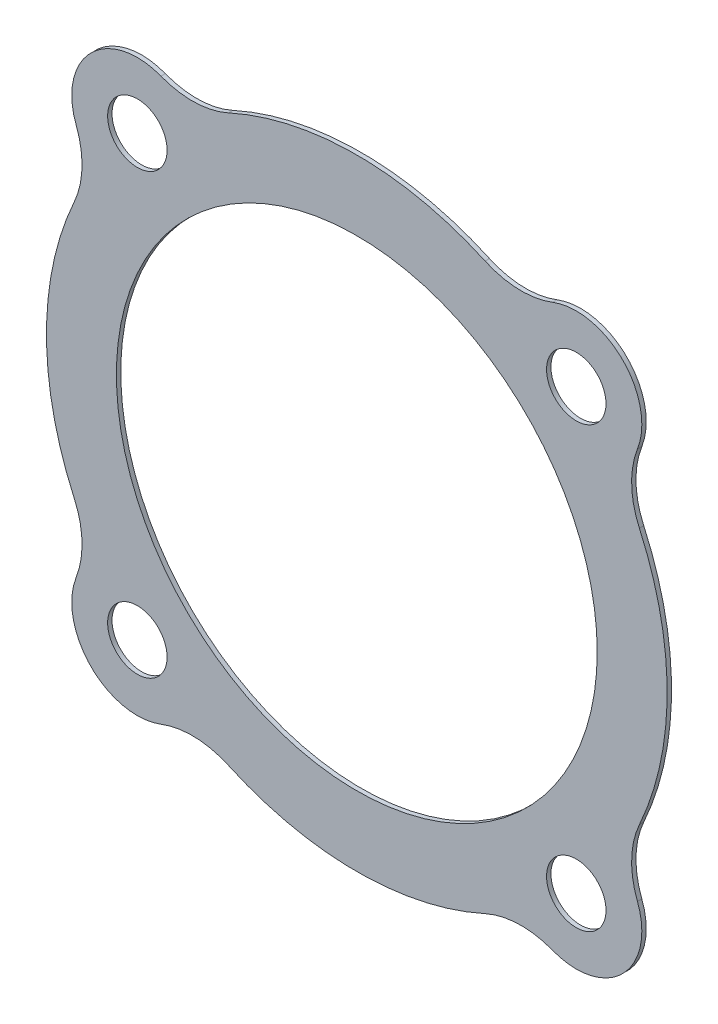
ISO-10303-21;
HEADER;
FILE_DESCRIPTION(('STEP AP214'),'2;1');
FILE_NAME('part.step','',(''),(''),'','','');
FILE_SCHEMA(('AUTOMOTIVE_DESIGN { 1 0 10303 214 1 1 1 1 }'));
ENDSEC;
DATA;
#1=APPLICATION_CONTEXT('core data for automotive mechanical design processes');
#2=APPLICATION_PROTOCOL_DEFINITION('international standard','automotive_design',2000,#1);
#3=PRODUCT_CONTEXT('',#1,'mechanical');
#4=PRODUCT('Part','Part','',(#3));
#5=PRODUCT_RELATED_PRODUCT_CATEGORY('part','',(#4));
#6=PRODUCT_DEFINITION_FORMATION('','',#4);
#7=PRODUCT_DEFINITION_CONTEXT('part definition',#1,'design');
#8=PRODUCT_DEFINITION('design','',#6,#7);
#9=PRODUCT_DEFINITION_SHAPE('','',#8);
#10=(LENGTH_UNIT() NAMED_UNIT(*) SI_UNIT(.MILLI.,.METRE.));
#11=(NAMED_UNIT(*) PLANE_ANGLE_UNIT() SI_UNIT($,.RADIAN.));
#12=(NAMED_UNIT(*) SI_UNIT($,.STERADIAN.) SOLID_ANGLE_UNIT());
#13=UNCERTAINTY_MEASURE_WITH_UNIT(LENGTH_MEASURE(1.E-05),#10,'distance_accuracy_value','');
#14=(GEOMETRIC_REPRESENTATION_CONTEXT(3) GLOBAL_UNCERTAINTY_ASSIGNED_CONTEXT((#13)) GLOBAL_UNIT_ASSIGNED_CONTEXT((#10,
#11,#12)) REPRESENTATION_CONTEXT('',''));
#15=CARTESIAN_POINT('',(0.,0.,0.));
#16=DIRECTION('',(0.,0.,1.));
#17=DIRECTION('',(1.,0.,0.));
#18=AXIS2_PLACEMENT_3D('',#15,#16,#17);
#19=CARTESIAN_POINT('',(27.882745113078,42.2486283056518,0.635));
#20=DIRECTION('',(0.,0.,1.));
#21=DIRECTION('',(1.,0.,0.));
#22=AXIS2_PLACEMENT_3D('',#19,#20,#21);
#23=PLANE('',#22);
#24=CARTESIAN_POINT('',(-31.8799092297955,-31.8799092297955,0.635));
#25=DIRECTION('',(0.,0.,1.));
#26=DIRECTION('',(1.,0.,0.));
#27=AXIS2_PLACEMENT_3D('',#24,#25,#26);
#28=CIRCLE('',#27,4.318);
#29=CARTESIAN_POINT('',(-27.5619092297955,-31.8799092297955,0.635));
#30=VERTEX_POINT('',#29);
#31=EDGE_CURVE('E347',#30,#30,#28,.T.);
#32=ORIENTED_EDGE('',*,*,#31,.F.);
#33=EDGE_LOOP('',(#32));
#34=FACE_BOUND('',#33,.T.);
#35=CARTESIAN_POINT('',(31.8799092297955,31.8799092297955,0.635));
#36=DIRECTION('',(0.,0.,1.));
#37=DIRECTION('',(1.,0.,0.));
#38=AXIS2_PLACEMENT_3D('',#35,#36,#37);
#39=CIRCLE('',#38,4.318);
#40=CARTESIAN_POINT('',(36.1979092297955,31.8799092297955,0.635));
#41=VERTEX_POINT('',#40);
#42=EDGE_CURVE('E359',#41,#41,#39,.T.);
#43=ORIENTED_EDGE('',*,*,#42,.F.);
#44=EDGE_LOOP('',(#43));
#45=FACE_BOUND('',#44,.T.);
#46=CARTESIAN_POINT('',(23.8855809963606,52.6173473815081,0.635));
#47=DIRECTION('',(0.,0.,-1.));
#48=DIRECTION('',(1.,0.,0.));
#49=AXIS2_PLACEMENT_3D('',#46,#47,#48);
#50=CIRCLE('',#49,12.7);
#51=CARTESIAN_POINT('',(28.4537685583234,40.7673827233866,0.635));
#52=VERTEX_POINT('',#51);
#53=CARTESIAN_POINT('',(18.6360027554022,41.0530952097481,0.635));
#54=VERTEX_POINT('',#53);
#55=EDGE_CURVE('E208',#52,#54,#50,.T.);
#56=ORIENTED_EDGE('',*,*,#55,.T.);
#57=CARTESIAN_POINT('',(0.,0.,0.635));
#58=DIRECTION('',(0.,0.,1.));
#59=DIRECTION('',(1.,0.,0.));
#60=AXIS2_PLACEMENT_3D('',#57,#58,#59);
#61=CIRCLE('',#60,45.085);
#62=CARTESIAN_POINT('',(-18.6360027554022,41.0530952097481,0.635));
#63=VERTEX_POINT('',#62);
#64=EDGE_CURVE('E116',#54,#63,#61,.T.);
#65=ORIENTED_EDGE('',*,*,#64,.T.);
#66=CARTESIAN_POINT('',(-23.8855809963606,52.6173473815081,0.635));
#67=DIRECTION('',(0.,0.,-1.));
#68=DIRECTION('',(1.,0.,0.));
#69=AXIS2_PLACEMENT_3D('',#66,#67,#68);
#70=CIRCLE('',#69,12.7);
#71=CARTESIAN_POINT('',(-28.4537685583234,40.7673827233866,0.635));
#72=VERTEX_POINT('',#71);
#73=EDGE_CURVE('E247',#63,#72,#70,.T.);
#74=ORIENTED_EDGE('',*,*,#73,.T.);
#75=CARTESIAN_POINT('',(-31.8799092297955,31.8799092297955,0.635));
#76=DIRECTION('',(0.,0.,1.));
#77=DIRECTION('',(1.,0.,0.));
#78=AXIS2_PLACEMENT_3D('',#75,#76,#77);
#79=CIRCLE('',#78,9.525);
#80=CARTESIAN_POINT('',(-40.7673827233866,28.4537685583234,0.635));
#81=VERTEX_POINT('',#80);
#82=EDGE_CURVE('E266',#72,#81,#79,.T.);
#83=ORIENTED_EDGE('',*,*,#82,.T.);
#84=CARTESIAN_POINT('',(-52.6173473815081,23.8855809963606,0.635));
#85=DIRECTION('',(0.,0.,-1.));
#86=DIRECTION('',(-1.,0.,0.));
#87=AXIS2_PLACEMENT_3D('',#84,#85,#86);
#88=CIRCLE('',#87,12.7);
#89=CARTESIAN_POINT('',(-41.0530952097481,18.6360027554022,0.635));
#90=VERTEX_POINT('',#89);
#91=EDGE_CURVE('E263',#81,#90,#88,.T.);
#92=ORIENTED_EDGE('',*,*,#91,.T.);
#93=CARTESIAN_POINT('',(0.,0.,0.635));
#94=DIRECTION('',(0.,0.,1.));
#95=DIRECTION('',(1.,0.,0.));
#96=AXIS2_PLACEMENT_3D('',#93,#94,#95);
#97=CIRCLE('',#96,45.085);
#98=CARTESIAN_POINT('',(-41.0530952097481,-18.6360027554022,0.635));
#99=VERTEX_POINT('',#98);
#100=EDGE_CURVE('E265',#90,#99,#97,.T.);
#101=ORIENTED_EDGE('',*,*,#100,.T.);
#102=CARTESIAN_POINT('',(-52.6173473815081,-23.8855809963606,0.635));
#103=DIRECTION('',(0.,0.,-1.));
#104=DIRECTION('',(1.,0.,0.));
#105=AXIS2_PLACEMENT_3D('',#102,#103,#104);
#106=CIRCLE('',#105,12.7);
#107=CARTESIAN_POINT('',(-40.7673827233866,-28.4537685583234,0.635));
#108=VERTEX_POINT('',#107);
#109=EDGE_CURVE('E268',#99,#108,#106,.T.);
#110=ORIENTED_EDGE('',*,*,#109,.T.);
#111=CARTESIAN_POINT('',(-31.8799092297955,-31.8799092297955,0.635));
#112=DIRECTION('',(0.,0.,1.));
#113=DIRECTION('',(1.,0.,0.));
#114=AXIS2_PLACEMENT_3D('',#111,#112,#113);
#115=CIRCLE('',#114,9.525);
#116=CARTESIAN_POINT('',(-28.4537685583234,-40.7673827233866,0.635));
#117=VERTEX_POINT('',#116);
#118=EDGE_CURVE('E274',#108,#117,#115,.T.);
#119=ORIENTED_EDGE('',*,*,#118,.T.);
#120=CARTESIAN_POINT('',(-23.8855809963606,-52.6173473815081,0.635));
#121=DIRECTION('',(0.,0.,-1.));
#122=DIRECTION('',(-1.,0.,0.));
#123=AXIS2_PLACEMENT_3D('',#120,#121,#122);
#124=CIRCLE('',#123,12.7);
#125=CARTESIAN_POINT('',(-18.6360027554022,-41.0530952097481,0.635));
#126=VERTEX_POINT('',#125);
#127=EDGE_CURVE('E276',#117,#126,#124,.T.);
#128=ORIENTED_EDGE('',*,*,#127,.T.);
#129=CARTESIAN_POINT('',(0.,0.,0.635));
#130=DIRECTION('',(0.,0.,1.));
#131=DIRECTION('',(1.,0.,0.));
#132=AXIS2_PLACEMENT_3D('',#129,#130,#131);
#133=CIRCLE('',#132,45.085);
#134=CARTESIAN_POINT('',(18.6360027554022,-41.0530952097481,0.635));
#135=VERTEX_POINT('',#134);
#136=EDGE_CURVE('E278',#126,#135,#133,.T.);
#137=ORIENTED_EDGE('',*,*,#136,.T.);
#138=CARTESIAN_POINT('',(23.8855809963606,-52.6173473815081,0.635));
#139=DIRECTION('',(0.,0.,-1.));
#140=DIRECTION('',(-1.,0.,0.));
#141=AXIS2_PLACEMENT_3D('',#138,#139,#140);
#142=CIRCLE('',#141,12.7);
#143=CARTESIAN_POINT('',(28.4537685583234,-40.7673827233866,0.635));
#144=VERTEX_POINT('',#143);
#145=EDGE_CURVE('E280',#135,#144,#142,.T.);
#146=ORIENTED_EDGE('',*,*,#145,.T.);
#147=CARTESIAN_POINT('',(31.8799092297955,-31.8799092297955,0.635));
#148=DIRECTION('',(0.,0.,1.));
#149=DIRECTION('',(1.,0.,0.));
#150=AXIS2_PLACEMENT_3D('',#147,#148,#149);
#151=CIRCLE('',#150,9.525);
#152=CARTESIAN_POINT('',(40.7673827233866,-28.4537685583234,0.635));
#153=VERTEX_POINT('',#152);
#154=EDGE_CURVE('E282',#144,#153,#151,.T.);
#155=ORIENTED_EDGE('',*,*,#154,.T.);
#156=CARTESIAN_POINT('',(52.6173473815081,-23.8855809963606,0.635));
#157=DIRECTION('',(0.,0.,-1.));
#158=DIRECTION('',(-1.,0.,0.));
#159=AXIS2_PLACEMENT_3D('',#156,#157,#158);
#160=CIRCLE('',#159,12.7);
#161=CARTESIAN_POINT('',(41.0530952097481,-18.6360027554022,0.635));
#162=VERTEX_POINT('',#161);
#163=EDGE_CURVE('E159',#153,#162,#160,.T.);
#164=ORIENTED_EDGE('',*,*,#163,.T.);
#165=CARTESIAN_POINT('',(0.,0.,0.635));
#166=DIRECTION('',(0.,0.,1.));
#167=DIRECTION('',(1.,0.,0.));
#168=AXIS2_PLACEMENT_3D('',#165,#166,#167);
#169=CIRCLE('',#168,45.085);
#170=CARTESIAN_POINT('',(41.0530952097481,18.6360027554022,0.635));
#171=VERTEX_POINT('',#170);
#172=EDGE_CURVE('E153',#162,#171,#169,.T.);
#173=ORIENTED_EDGE('',*,*,#172,.T.);
#174=CARTESIAN_POINT('',(52.6173473815081,23.8855809963606,0.635));
#175=DIRECTION('',(0.,0.,-1.));
#176=DIRECTION('',(-1.,0.,0.));
#177=AXIS2_PLACEMENT_3D('',#174,#175,#176);
#178=CIRCLE('',#177,12.7);
#179=CARTESIAN_POINT('',(40.7673827233866,28.4537685583234,0.635));
#180=VERTEX_POINT('',#179);
#181=EDGE_CURVE('E157',#171,#180,#178,.T.);
#182=ORIENTED_EDGE('',*,*,#181,.T.);
#183=CARTESIAN_POINT('',(31.8799092297955,31.8799092297955,0.635));
#184=DIRECTION('',(0.,0.,1.));
#185=DIRECTION('',(1.,0.,0.));
#186=AXIS2_PLACEMENT_3D('',#183,#184,#185);
#187=CIRCLE('',#186,9.525);
#188=EDGE_CURVE('E49',#180,#52,#187,.T.);
#189=ORIENTED_EDGE('',*,*,#188,.T.);
#190=EDGE_LOOP('',(#56,#65,#74,#83,#92,#101,#110,#119,#128,#137,#146,#155,#164,#173,#182,#189));
#191=FACE_BOUND('',#190,.T.);
#192=CARTESIAN_POINT('',(0.,0.,0.635));
#193=DIRECTION('',(0.,0.,1.));
#194=DIRECTION('',(1.,0.,0.));
#195=AXIS2_PLACEMENT_3D('',#192,#193,#194);
#196=CIRCLE('',#195,34.925);
#197=CARTESIAN_POINT('',(34.925,0.,0.635));
#198=VERTEX_POINT('',#197);
#199=EDGE_CURVE('E181',#198,#198,#196,.T.);
#200=ORIENTED_EDGE('',*,*,#199,.F.);
#201=EDGE_LOOP('',(#200));
#202=FACE_BOUND('',#201,.T.);
#203=CARTESIAN_POINT('',(-31.8799092297955,31.8799092297955,0.635));
#204=DIRECTION('',(0.,0.,1.));
#205=DIRECTION('',(1.,0.,0.));
#206=AXIS2_PLACEMENT_3D('',#203,#204,#205);
#207=CIRCLE('',#206,4.318);
#208=CARTESIAN_POINT('',(-27.5619092297955,31.8799092297955,0.635));
#209=VERTEX_POINT('',#208);
#210=EDGE_CURVE('E353',#209,#209,#207,.T.);
#211=ORIENTED_EDGE('',*,*,#210,.F.);
#212=EDGE_LOOP('',(#211));
#213=FACE_BOUND('',#212,.T.);
#214=CARTESIAN_POINT('',(31.8799092297955,-31.8799092297955,0.635));
#215=DIRECTION('',(0.,0.,1.));
#216=DIRECTION('',(1.,0.,0.));
#217=AXIS2_PLACEMENT_3D('',#214,#215,#216);
#218=CIRCLE('',#217,4.318);
#219=CARTESIAN_POINT('',(36.1979092297955,-31.8799092297955,0.635));
#220=VERTEX_POINT('',#219);
#221=EDGE_CURVE('E338',#220,#220,#218,.T.);
#222=ORIENTED_EDGE('',*,*,#221,.F.);
#223=EDGE_LOOP('',(#222));
#224=FACE_BOUND('',#223,.T.);
#225=ADVANCED_FACE('F32',(#34,#45,#191,#202,#213,#224),#23,.T.);
#226=CARTESIAN_POINT('',(27.882745113078,42.2486283056518,0.));
#227=DIRECTION('',(0.,0.,1.));
#228=DIRECTION('',(1.,0.,0.));
#229=AXIS2_PLACEMENT_3D('',#226,#227,#228);
#230=PLANE('',#229);
#231=CARTESIAN_POINT('',(-31.8799092297955,-31.8799092297955,0.));
#232=DIRECTION('',(0.,0.,1.));
#233=DIRECTION('',(1.,0.,0.));
#234=AXIS2_PLACEMENT_3D('',#231,#232,#233);
#235=CIRCLE('',#234,4.318);
#236=CARTESIAN_POINT('',(-27.5619092297955,-31.8799092297955,0.));
#237=VERTEX_POINT('',#236);
#238=EDGE_CURVE('E344',#237,#237,#235,.T.);
#239=ORIENTED_EDGE('',*,*,#238,.T.);
#240=EDGE_LOOP('',(#239));
#241=FACE_BOUND('',#240,.T.);
#242=CARTESIAN_POINT('',(31.8799092297955,31.8799092297955,0.));
#243=DIRECTION('',(0.,0.,1.));
#244=DIRECTION('',(1.,0.,0.));
#245=AXIS2_PLACEMENT_3D('',#242,#243,#244);
#246=CIRCLE('',#245,4.318);
#247=CARTESIAN_POINT('',(36.1979092297955,31.8799092297955,0.));
#248=VERTEX_POINT('',#247);
#249=EDGE_CURVE('E356',#248,#248,#246,.T.);
#250=ORIENTED_EDGE('',*,*,#249,.T.);
#251=EDGE_LOOP('',(#250));
#252=FACE_BOUND('',#251,.T.);
#253=CARTESIAN_POINT('',(23.8855809963606,52.6173473815081,0.));
#254=DIRECTION('',(0.,0.,-1.));
#255=DIRECTION('',(1.,0.,0.));
#256=AXIS2_PLACEMENT_3D('',#253,#254,#255);
#257=CIRCLE('',#256,12.7);
#258=CARTESIAN_POINT('',(28.4537685583234,40.7673827233866,0.));
#259=VERTEX_POINT('',#258);
#260=CARTESIAN_POINT('',(18.6360027554022,41.0530952097481,0.));
#261=VERTEX_POINT('',#260);
#262=EDGE_CURVE('E177',#259,#261,#257,.T.);
#263=ORIENTED_EDGE('',*,*,#262,.F.);
#264=CARTESIAN_POINT('',(31.8799092297955,31.8799092297955,0.));
#265=DIRECTION('',(0.,0.,1.));
#266=DIRECTION('',(1.,0.,0.));
#267=AXIS2_PLACEMENT_3D('',#264,#265,#266);
#268=CIRCLE('',#267,9.525);
#269=CARTESIAN_POINT('',(40.7673827233866,28.4537685583234,0.));
#270=VERTEX_POINT('',#269);
#271=EDGE_CURVE('E108',#270,#259,#268,.T.);
#272=ORIENTED_EDGE('',*,*,#271,.F.);
#273=CARTESIAN_POINT('',(52.6173473815081,23.8855809963606,0.));
#274=DIRECTION('',(0.,0.,-1.));
#275=DIRECTION('',(-1.,0.,0.));
#276=AXIS2_PLACEMENT_3D('',#273,#274,#275);
#277=CIRCLE('',#276,12.7);
#278=CARTESIAN_POINT('',(41.0530952097481,18.6360027554022,0.));
#279=VERTEX_POINT('',#278);
#280=EDGE_CURVE('E102',#279,#270,#277,.T.);
#281=ORIENTED_EDGE('',*,*,#280,.F.);
#282=CARTESIAN_POINT('',(0.,0.,0.));
#283=DIRECTION('',(0.,0.,1.));
#284=DIRECTION('',(1.,0.,0.));
#285=AXIS2_PLACEMENT_3D('',#282,#283,#284);
#286=CIRCLE('',#285,45.085);
#287=CARTESIAN_POINT('',(41.0530952097481,-18.6360027554022,0.));
#288=VERTEX_POINT('',#287);
#289=EDGE_CURVE('E167',#288,#279,#286,.T.);
#290=ORIENTED_EDGE('',*,*,#289,.F.);
#291=CARTESIAN_POINT('',(52.6173473815081,-23.8855809963606,0.));
#292=DIRECTION('',(0.,0.,-1.));
#293=DIRECTION('',(-1.,0.,0.));
#294=AXIS2_PLACEMENT_3D('',#291,#292,#293);
#295=CIRCLE('',#294,12.7);
#296=CARTESIAN_POINT('',(40.7673827233866,-28.4537685583234,0.));
#297=VERTEX_POINT('',#296);
#298=EDGE_CURVE('E203',#297,#288,#295,.T.);
#299=ORIENTED_EDGE('',*,*,#298,.F.);
#300=CARTESIAN_POINT('',(31.8799092297955,-31.8799092297955,0.));
#301=DIRECTION('',(0.,0.,1.));
#302=DIRECTION('',(1.,0.,0.));
#303=AXIS2_PLACEMENT_3D('',#300,#301,#302);
#304=CIRCLE('',#303,9.525);
#305=CARTESIAN_POINT('',(28.4537685583234,-40.7673827233866,0.));
#306=VERTEX_POINT('',#305);
#307=EDGE_CURVE('E201',#306,#297,#304,.T.);
#308=ORIENTED_EDGE('',*,*,#307,.F.);
#309=CARTESIAN_POINT('',(23.8855809963606,-52.6173473815081,0.));
#310=DIRECTION('',(0.,0.,-1.));
#311=DIRECTION('',(-1.,0.,0.));
#312=AXIS2_PLACEMENT_3D('',#309,#310,#311);
#313=CIRCLE('',#312,12.7);
#314=CARTESIAN_POINT('',(18.6360027554022,-41.0530952097481,0.));
#315=VERTEX_POINT('',#314);
#316=EDGE_CURVE('E199',#315,#306,#313,.T.);
#317=ORIENTED_EDGE('',*,*,#316,.F.);
#318=CARTESIAN_POINT('',(0.,0.,0.));
#319=DIRECTION('',(0.,0.,1.));
#320=DIRECTION('',(1.,0.,0.));
#321=AXIS2_PLACEMENT_3D('',#318,#319,#320);
#322=CIRCLE('',#321,45.085);
#323=CARTESIAN_POINT('',(-18.6360027554022,-41.0530952097481,0.));
#324=VERTEX_POINT('',#323);
#325=EDGE_CURVE('E197',#324,#315,#322,.T.);
#326=ORIENTED_EDGE('',*,*,#325,.F.);
#327=CARTESIAN_POINT('',(-23.8855809963606,-52.6173473815081,0.));
#328=DIRECTION('',(0.,0.,-1.));
#329=DIRECTION('',(-1.,0.,0.));
#330=AXIS2_PLACEMENT_3D('',#327,#328,#329);
#331=CIRCLE('',#330,12.7);
#332=CARTESIAN_POINT('',(-28.4537685583234,-40.7673827233866,0.));
#333=VERTEX_POINT('',#332);
#334=EDGE_CURVE('E195',#333,#324,#331,.T.);
#335=ORIENTED_EDGE('',*,*,#334,.F.);
#336=CARTESIAN_POINT('',(-31.8799092297955,-31.8799092297955,0.));
#337=DIRECTION('',(0.,0.,1.));
#338=DIRECTION('',(1.,0.,0.));
#339=AXIS2_PLACEMENT_3D('',#336,#337,#338);
#340=CIRCLE('',#339,9.525);
#341=CARTESIAN_POINT('',(-40.7673827233866,-28.4537685583234,0.));
#342=VERTEX_POINT('',#341);
#343=EDGE_CURVE('E193',#342,#333,#340,.T.);
#344=ORIENTED_EDGE('',*,*,#343,.F.);
#345=CARTESIAN_POINT('',(-52.6173473815081,-23.8855809963606,0.));
#346=DIRECTION('',(0.,0.,-1.));
#347=DIRECTION('',(1.,0.,0.));
#348=AXIS2_PLACEMENT_3D('',#345,#346,#347);
#349=CIRCLE('',#348,12.7);
#350=CARTESIAN_POINT('',(-41.0530952097481,-18.6360027554022,0.));
#351=VERTEX_POINT('',#350);
#352=EDGE_CURVE('E191',#351,#342,#349,.T.);
#353=ORIENTED_EDGE('',*,*,#352,.F.);
#354=CARTESIAN_POINT('',(0.,0.,0.));
#355=DIRECTION('',(0.,0.,1.));
#356=DIRECTION('',(1.,0.,0.));
#357=AXIS2_PLACEMENT_3D('',#354,#355,#356);
#358=CIRCLE('',#357,45.085);
#359=CARTESIAN_POINT('',(-41.0530952097481,18.6360027554022,0.));
#360=VERTEX_POINT('',#359);
#361=EDGE_CURVE('E189',#360,#351,#358,.T.);
#362=ORIENTED_EDGE('',*,*,#361,.F.);
#363=CARTESIAN_POINT('',(-52.6173473815081,23.8855809963606,0.));
#364=DIRECTION('',(0.,0.,-1.));
#365=DIRECTION('',(-1.,0.,0.));
#366=AXIS2_PLACEMENT_3D('',#363,#364,#365);
#367=CIRCLE('',#366,12.7);
#368=CARTESIAN_POINT('',(-40.7673827233866,28.4537685583234,0.));
#369=VERTEX_POINT('',#368);
#370=EDGE_CURVE('E187',#369,#360,#367,.T.);
#371=ORIENTED_EDGE('',*,*,#370,.F.);
#372=CARTESIAN_POINT('',(-31.8799092297955,31.8799092297955,0.));
#373=DIRECTION('',(0.,0.,1.));
#374=DIRECTION('',(1.,0.,0.));
#375=AXIS2_PLACEMENT_3D('',#372,#373,#374);
#376=CIRCLE('',#375,9.525);
#377=CARTESIAN_POINT('',(-28.4537685583234,40.7673827233866,0.));
#378=VERTEX_POINT('',#377);
#379=EDGE_CURVE('E185',#378,#369,#376,.T.);
#380=ORIENTED_EDGE('',*,*,#379,.F.);
#381=CARTESIAN_POINT('',(-23.8855809963606,52.6173473815081,0.));
#382=DIRECTION('',(0.,0.,-1.));
#383=DIRECTION('',(1.,0.,0.));
#384=AXIS2_PLACEMENT_3D('',#381,#382,#383);
#385=CIRCLE('',#384,12.7);
#386=CARTESIAN_POINT('',(-18.6360027554022,41.0530952097481,0.));
#387=VERTEX_POINT('',#386);
#388=EDGE_CURVE('E183',#387,#378,#385,.T.);
#389=ORIENTED_EDGE('',*,*,#388,.F.);
#390=CARTESIAN_POINT('',(0.,0.,0.));
#391=DIRECTION('',(0.,0.,1.));
#392=DIRECTION('',(1.,0.,0.));
#393=AXIS2_PLACEMENT_3D('',#390,#391,#392);
#394=CIRCLE('',#393,45.085);
#395=EDGE_CURVE('E180',#261,#387,#394,.T.);
#396=ORIENTED_EDGE('',*,*,#395,.F.);
#397=EDGE_LOOP('',(#263,#272,#281,#290,#299,#308,#317,#326,#335,#344,#353,#362,#371,#380,#389,#396));
#398=FACE_BOUND('',#397,.T.);
#399=CARTESIAN_POINT('',(0.,0.,0.));
#400=DIRECTION('',(0.,0.,1.));
#401=DIRECTION('',(1.,0.,0.));
#402=AXIS2_PLACEMENT_3D('',#399,#400,#401);
#403=CIRCLE('',#402,34.925);
#404=CARTESIAN_POINT('',(34.925,0.,0.));
#405=VERTEX_POINT('',#404);
#406=EDGE_CURVE('E362',#405,#405,#403,.T.);
#407=ORIENTED_EDGE('',*,*,#406,.T.);
#408=EDGE_LOOP('',(#407));
#409=FACE_BOUND('',#408,.T.);
#410=CARTESIAN_POINT('',(-31.8799092297955,31.8799092297955,0.));
#411=DIRECTION('',(0.,0.,1.));
#412=DIRECTION('',(1.,0.,0.));
#413=AXIS2_PLACEMENT_3D('',#410,#411,#412);
#414=CIRCLE('',#413,4.318);
#415=CARTESIAN_POINT('',(-27.5619092297955,31.8799092297955,0.));
#416=VERTEX_POINT('',#415);
#417=EDGE_CURVE('E350',#416,#416,#414,.T.);
#418=ORIENTED_EDGE('',*,*,#417,.T.);
#419=EDGE_LOOP('',(#418));
#420=FACE_BOUND('',#419,.T.);
#421=CARTESIAN_POINT('',(31.8799092297955,-31.8799092297955,0.));
#422=DIRECTION('',(0.,0.,1.));
#423=DIRECTION('',(1.,0.,0.));
#424=AXIS2_PLACEMENT_3D('',#421,#422,#423);
#425=CIRCLE('',#424,4.318);
#426=CARTESIAN_POINT('',(36.1979092297955,-31.8799092297955,0.));
#427=VERTEX_POINT('',#426);
#428=EDGE_CURVE('E341',#427,#427,#425,.T.);
#429=ORIENTED_EDGE('',*,*,#428,.T.);
#430=EDGE_LOOP('',(#429));
#431=FACE_BOUND('',#430,.T.);
#432=ADVANCED_FACE('F251',(#241,#252,#398,#409,#420,#431),#230,.F.);
#433=CARTESIAN_POINT('',(23.8855809963606,52.6173473815081,0.635));
#434=DIRECTION('',(0.,0.,-1.));
#435=DIRECTION('',(-1.,0.,0.));
#436=AXIS2_PLACEMENT_3D('',#433,#434,#435);
#437=CYLINDRICAL_SURFACE('',#436,12.7);
#438=ORIENTED_EDGE('',*,*,#262,.T.);
#439=DIRECTION('',(0.,0.,-1.));
#440=VECTOR('',#439,1.);
#441=CARTESIAN_POINT('',(18.6360027554022,41.0530952097481,0.635));
#442=LINE('',#441,#440);
#443=EDGE_CURVE('E11',#54,#261,#442,.T.);
#444=ORIENTED_EDGE('',*,*,#443,.F.);
#445=ORIENTED_EDGE('',*,*,#55,.F.);
#446=DIRECTION('',(0.,0.,-1.));
#447=VECTOR('',#446,1.);
#448=CARTESIAN_POINT('',(28.4537685583234,40.7673827233866,0.635));
#449=LINE('',#448,#447);
#450=EDGE_CURVE('E173',#52,#259,#449,.T.);
#451=ORIENTED_EDGE('',*,*,#450,.T.);
#452=EDGE_LOOP('',(#438,#444,#445,#451));
#453=FACE_BOUND('',#452,.T.);
#454=ADVANCED_FACE('F34',(#453),#437,.F.);
#455=CARTESIAN_POINT('',(0.,0.,0.635));
#456=DIRECTION('',(0.,0.,-1.));
#457=DIRECTION('',(-1.,0.,0.));
#458=AXIS2_PLACEMENT_3D('',#455,#456,#457);
#459=CYLINDRICAL_SURFACE('',#458,45.085);
#460=ORIENTED_EDGE('',*,*,#395,.T.);
#461=DIRECTION('',(0.,0.,-1.));
#462=VECTOR('',#461,1.);
#463=CARTESIAN_POINT('',(-18.6360027554022,41.0530952097481,0.635));
#464=LINE('',#463,#462);
#465=EDGE_CURVE('E41',#63,#387,#464,.T.);
#466=ORIENTED_EDGE('',*,*,#465,.F.);
#467=ORIENTED_EDGE('',*,*,#64,.F.);
#468=ORIENTED_EDGE('',*,*,#443,.T.);
#469=EDGE_LOOP('',(#460,#466,#467,#468));
#470=FACE_BOUND('',#469,.T.);
#471=ADVANCED_FACE('F520',(#470),#459,.T.);
#472=CARTESIAN_POINT('',(-23.8855809963606,52.6173473815081,0.635));
#473=DIRECTION('',(0.,0.,-1.));
#474=DIRECTION('',(-1.,0.,0.));
#475=AXIS2_PLACEMENT_3D('',#472,#473,#474);
#476=CYLINDRICAL_SURFACE('',#475,12.7);
#477=ORIENTED_EDGE('',*,*,#388,.T.);
#478=DIRECTION('',(0.,0.,-1.));
#479=VECTOR('',#478,1.);
#480=CARTESIAN_POINT('',(-28.4537685583234,40.7673827233866,0.635));
#481=LINE('',#480,#479);
#482=EDGE_CURVE('E239',#72,#378,#481,.T.);
#483=ORIENTED_EDGE('',*,*,#482,.F.);
#484=ORIENTED_EDGE('',*,*,#73,.F.);
#485=ORIENTED_EDGE('',*,*,#465,.T.);
#486=EDGE_LOOP('',(#477,#483,#484,#485));
#487=FACE_BOUND('',#486,.T.);
#488=ADVANCED_FACE('F245',(#487),#476,.F.);
#489=CARTESIAN_POINT('',(-31.8799092297955,31.8799092297955,0.635));
#490=DIRECTION('',(0.,0.,-1.));
#491=DIRECTION('',(-1.,0.,0.));
#492=AXIS2_PLACEMENT_3D('',#489,#490,#491);
#493=CYLINDRICAL_SURFACE('',#492,9.525);
#494=ORIENTED_EDGE('',*,*,#379,.T.);
#495=DIRECTION('',(0.,0.,-1.));
#496=VECTOR('',#495,1.);
#497=CARTESIAN_POINT('',(-40.7673827233866,28.4537685583234,0.635));
#498=LINE('',#497,#496);
#499=EDGE_CURVE('E236',#81,#369,#498,.T.);
#500=ORIENTED_EDGE('',*,*,#499,.F.);
#501=ORIENTED_EDGE('',*,*,#82,.F.);
#502=ORIENTED_EDGE('',*,*,#482,.T.);
#503=EDGE_LOOP('',(#494,#500,#501,#502));
#504=FACE_BOUND('',#503,.T.);
#505=ADVANCED_FACE('F257',(#504),#493,.T.);
#506=CARTESIAN_POINT('',(-52.6173473815081,23.8855809963606,0.635));
#507=DIRECTION('',(0.,0.,-1.));
#508=DIRECTION('',(-1.,0.,0.));
#509=AXIS2_PLACEMENT_3D('',#506,#507,#508);
#510=CYLINDRICAL_SURFACE('',#509,12.7);
#511=ORIENTED_EDGE('',*,*,#370,.T.);
#512=DIRECTION('',(0.,0.,-1.));
#513=VECTOR('',#512,1.);
#514=CARTESIAN_POINT('',(-41.0530952097481,18.6360027554022,0.635));
#515=LINE('',#514,#513);
#516=EDGE_CURVE('E233',#90,#360,#515,.T.);
#517=ORIENTED_EDGE('',*,*,#516,.F.);
#518=ORIENTED_EDGE('',*,*,#91,.F.);
#519=ORIENTED_EDGE('',*,*,#499,.T.);
#520=EDGE_LOOP('',(#511,#517,#518,#519));
#521=FACE_BOUND('',#520,.T.);
#522=ADVANCED_FACE('F261',(#521),#510,.F.);
#523=CARTESIAN_POINT('',(0.,0.,0.635));
#524=DIRECTION('',(0.,0.,-1.));
#525=DIRECTION('',(-1.,0.,0.));
#526=AXIS2_PLACEMENT_3D('',#523,#524,#525);
#527=CYLINDRICAL_SURFACE('',#526,45.085);
#528=ORIENTED_EDGE('',*,*,#361,.T.);
#529=DIRECTION('',(0.,0.,-1.));
#530=VECTOR('',#529,1.);
#531=CARTESIAN_POINT('',(-41.0530952097481,-18.6360027554022,0.635));
#532=LINE('',#531,#530);
#533=EDGE_CURVE('E230',#99,#351,#532,.T.);
#534=ORIENTED_EDGE('',*,*,#533,.F.);
#535=ORIENTED_EDGE('',*,*,#100,.F.);
#536=ORIENTED_EDGE('',*,*,#516,.T.);
#537=EDGE_LOOP('',(#528,#534,#535,#536));
#538=FACE_BOUND('',#537,.T.);
#539=ADVANCED_FACE('F485',(#538),#527,.T.);
#540=CARTESIAN_POINT('',(-52.6173473815081,-23.8855809963606,0.635));
#541=DIRECTION('',(0.,0.,-1.));
#542=DIRECTION('',(-1.,0.,0.));
#543=AXIS2_PLACEMENT_3D('',#540,#541,#542);
#544=CYLINDRICAL_SURFACE('',#543,12.7);
#545=ORIENTED_EDGE('',*,*,#352,.T.);
#546=DIRECTION('',(0.,0.,-1.));
#547=VECTOR('',#546,1.);
#548=CARTESIAN_POINT('',(-40.7673827233866,-28.4537685583234,0.635));
#549=LINE('',#548,#547);
#550=EDGE_CURVE('E227',#108,#342,#549,.T.);
#551=ORIENTED_EDGE('',*,*,#550,.F.);
#552=ORIENTED_EDGE('',*,*,#109,.F.);
#553=ORIENTED_EDGE('',*,*,#533,.T.);
#554=EDGE_LOOP('',(#545,#551,#552,#553));
#555=FACE_BOUND('',#554,.T.);
#556=ADVANCED_FACE('F475',(#555),#544,.F.);
#557=CARTESIAN_POINT('',(-31.8799092297955,-31.8799092297955,0.635));
#558=DIRECTION('',(0.,0.,-1.));
#559=DIRECTION('',(-1.,0.,0.));
#560=AXIS2_PLACEMENT_3D('',#557,#558,#559);
#561=CYLINDRICAL_SURFACE('',#560,9.525);
#562=ORIENTED_EDGE('',*,*,#343,.T.);
#563=DIRECTION('',(0.,0.,-1.));
#564=VECTOR('',#563,1.);
#565=CARTESIAN_POINT('',(-28.4537685583234,-40.7673827233866,0.635));
#566=LINE('',#565,#564);
#567=EDGE_CURVE('E224',#117,#333,#566,.T.);
#568=ORIENTED_EDGE('',*,*,#567,.F.);
#569=ORIENTED_EDGE('',*,*,#118,.F.);
#570=ORIENTED_EDGE('',*,*,#550,.T.);
#571=EDGE_LOOP('',(#562,#568,#569,#570));
#572=FACE_BOUND('',#571,.T.);
#573=ADVANCED_FACE('F465',(#572),#561,.T.);
#574=CARTESIAN_POINT('',(-23.8855809963606,-52.6173473815081,0.635));
#575=DIRECTION('',(0.,0.,-1.));
#576=DIRECTION('',(-1.,0.,0.));
#577=AXIS2_PLACEMENT_3D('',#574,#575,#576);
#578=CYLINDRICAL_SURFACE('',#577,12.7);
#579=ORIENTED_EDGE('',*,*,#334,.T.);
#580=DIRECTION('',(0.,0.,-1.));
#581=VECTOR('',#580,1.);
#582=CARTESIAN_POINT('',(-18.6360027554022,-41.0530952097481,0.635));
#583=LINE('',#582,#581);
#584=EDGE_CURVE('E221',#126,#324,#583,.T.);
#585=ORIENTED_EDGE('',*,*,#584,.F.);
#586=ORIENTED_EDGE('',*,*,#127,.F.);
#587=ORIENTED_EDGE('',*,*,#567,.T.);
#588=EDGE_LOOP('',(#579,#585,#586,#587));
#589=FACE_BOUND('',#588,.T.);
#590=ADVANCED_FACE('F455',(#589),#578,.F.);
#591=CARTESIAN_POINT('',(0.,0.,0.635));
#592=DIRECTION('',(0.,0.,-1.));
#593=DIRECTION('',(-1.,0.,0.));
#594=AXIS2_PLACEMENT_3D('',#591,#592,#593);
#595=CYLINDRICAL_SURFACE('',#594,45.085);
#596=ORIENTED_EDGE('',*,*,#325,.T.);
#597=DIRECTION('',(0.,0.,-1.));
#598=VECTOR('',#597,1.);
#599=CARTESIAN_POINT('',(18.6360027554022,-41.0530952097481,0.635));
#600=LINE('',#599,#598);
#601=EDGE_CURVE('E218',#135,#315,#600,.T.);
#602=ORIENTED_EDGE('',*,*,#601,.F.);
#603=ORIENTED_EDGE('',*,*,#136,.F.);
#604=ORIENTED_EDGE('',*,*,#584,.T.);
#605=EDGE_LOOP('',(#596,#602,#603,#604));
#606=FACE_BOUND('',#605,.T.);
#607=ADVANCED_FACE('F445',(#606),#595,.T.);
#608=CARTESIAN_POINT('',(23.8855809963606,-52.6173473815081,0.635));
#609=DIRECTION('',(0.,0.,-1.));
#610=DIRECTION('',(-1.,0.,0.));
#611=AXIS2_PLACEMENT_3D('',#608,#609,#610);
#612=CYLINDRICAL_SURFACE('',#611,12.7);
#613=ORIENTED_EDGE('',*,*,#316,.T.);
#614=DIRECTION('',(0.,0.,-1.));
#615=VECTOR('',#614,1.);
#616=CARTESIAN_POINT('',(28.4537685583234,-40.7673827233866,0.635));
#617=LINE('',#616,#615);
#618=EDGE_CURVE('E215',#144,#306,#617,.T.);
#619=ORIENTED_EDGE('',*,*,#618,.F.);
#620=ORIENTED_EDGE('',*,*,#145,.F.);
#621=ORIENTED_EDGE('',*,*,#601,.T.);
#622=EDGE_LOOP('',(#613,#619,#620,#621));
#623=FACE_BOUND('',#622,.T.);
#624=ADVANCED_FACE('F436',(#623),#612,.F.);
#625=CARTESIAN_POINT('',(31.8799092297955,-31.8799092297955,0.635));
#626=DIRECTION('',(0.,0.,-1.));
#627=DIRECTION('',(-1.,0.,0.));
#628=AXIS2_PLACEMENT_3D('',#625,#626,#627);
#629=CYLINDRICAL_SURFACE('',#628,9.525);
#630=ORIENTED_EDGE('',*,*,#307,.T.);
#631=DIRECTION('',(0.,0.,-1.));
#632=VECTOR('',#631,1.);
#633=CARTESIAN_POINT('',(40.7673827233866,-28.4537685583234,0.635));
#634=LINE('',#633,#632);
#635=EDGE_CURVE('E212',#153,#297,#634,.T.);
#636=ORIENTED_EDGE('',*,*,#635,.F.);
#637=ORIENTED_EDGE('',*,*,#154,.F.);
#638=ORIENTED_EDGE('',*,*,#618,.T.);
#639=EDGE_LOOP('',(#630,#636,#637,#638));
#640=FACE_BOUND('',#639,.T.);
#641=ADVANCED_FACE('F288',(#640),#629,.T.);
#642=CARTESIAN_POINT('',(52.6173473815081,-23.8855809963606,0.635));
#643=DIRECTION('',(0.,0.,-1.));
#644=DIRECTION('',(-1.,0.,0.));
#645=AXIS2_PLACEMENT_3D('',#642,#643,#644);
#646=CYLINDRICAL_SURFACE('',#645,12.7);
#647=ORIENTED_EDGE('',*,*,#298,.T.);
#648=DIRECTION('',(0.,0.,-1.));
#649=VECTOR('',#648,1.);
#650=CARTESIAN_POINT('',(41.0530952097481,-18.6360027554022,0.635));
#651=LINE('',#650,#649);
#652=EDGE_CURVE('E168',#162,#288,#651,.T.);
#653=ORIENTED_EDGE('',*,*,#652,.F.);
#654=ORIENTED_EDGE('',*,*,#163,.F.);
#655=ORIENTED_EDGE('',*,*,#635,.T.);
#656=EDGE_LOOP('',(#647,#653,#654,#655));
#657=FACE_BOUND('',#656,.T.);
#658=ADVANCED_FACE('F292',(#657),#646,.F.);
#659=CARTESIAN_POINT('',(0.,0.,0.635));
#660=DIRECTION('',(0.,0.,-1.));
#661=DIRECTION('',(-1.,0.,0.));
#662=AXIS2_PLACEMENT_3D('',#659,#660,#661);
#663=CYLINDRICAL_SURFACE('',#662,45.085);
#664=ORIENTED_EDGE('',*,*,#289,.T.);
#665=DIRECTION('',(0.,0.,-1.));
#666=VECTOR('',#665,1.);
#667=CARTESIAN_POINT('',(41.0530952097481,18.6360027554022,0.635));
#668=LINE('',#667,#666);
#669=EDGE_CURVE('E164',#171,#279,#668,.T.);
#670=ORIENTED_EDGE('',*,*,#669,.F.);
#671=ORIENTED_EDGE('',*,*,#172,.F.);
#672=ORIENTED_EDGE('',*,*,#652,.T.);
#673=EDGE_LOOP('',(#664,#670,#671,#672));
#674=FACE_BOUND('',#673,.T.);
#675=ADVANCED_FACE('F165',(#674),#663,.T.);
#676=CARTESIAN_POINT('',(52.6173473815081,23.8855809963606,0.635));
#677=DIRECTION('',(0.,0.,-1.));
#678=DIRECTION('',(-1.,0.,0.));
#679=AXIS2_PLACEMENT_3D('',#676,#677,#678);
#680=CYLINDRICAL_SURFACE('',#679,12.7);
#681=ORIENTED_EDGE('',*,*,#280,.T.);
#682=DIRECTION('',(0.,0.,-1.));
#683=VECTOR('',#682,1.);
#684=CARTESIAN_POINT('',(40.7673827233866,28.4537685583234,0.635));
#685=LINE('',#684,#683);
#686=EDGE_CURVE('E169',#180,#270,#685,.T.);
#687=ORIENTED_EDGE('',*,*,#686,.F.);
#688=ORIENTED_EDGE('',*,*,#181,.F.);
#689=ORIENTED_EDGE('',*,*,#669,.T.);
#690=EDGE_LOOP('',(#681,#687,#688,#689));
#691=FACE_BOUND('',#690,.T.);
#692=ADVANCED_FACE('F171',(#691),#680,.F.);
#693=CARTESIAN_POINT('',(31.8799092297955,31.8799092297955,0.635));
#694=DIRECTION('',(0.,0.,-1.));
#695=DIRECTION('',(-1.,0.,0.));
#696=AXIS2_PLACEMENT_3D('',#693,#694,#695);
#697=CYLINDRICAL_SURFACE('',#696,9.525);
#698=ORIENTED_EDGE('',*,*,#271,.T.);
#699=ORIENTED_EDGE('',*,*,#450,.F.);
#700=ORIENTED_EDGE('',*,*,#188,.F.);
#701=ORIENTED_EDGE('',*,*,#686,.T.);
#702=EDGE_LOOP('',(#698,#699,#700,#701));
#703=FACE_BOUND('',#702,.T.);
#704=ADVANCED_FACE('F296',(#703),#697,.T.);
#705=CARTESIAN_POINT('',(0.,0.,0.635));
#706=DIRECTION('',(0.,0.,-1.));
#707=DIRECTION('',(-1.,0.,0.));
#708=AXIS2_PLACEMENT_3D('',#705,#706,#707);
#709=CYLINDRICAL_SURFACE('',#708,34.925);
#710=ORIENTED_EDGE('',*,*,#199,.T.);
#711=EDGE_LOOP('',(#710));
#712=FACE_BOUND('',#711,.T.);
#713=ORIENTED_EDGE('',*,*,#406,.F.);
#714=EDGE_LOOP('',(#713));
#715=FACE_BOUND('',#714,.T.);
#716=ADVANCED_FACE('F298',(#712,#715),#709,.F.);
#717=CARTESIAN_POINT('',(31.8799092297955,31.8799092297955,0.635));
#718=DIRECTION('',(0.,0.,-1.));
#719=DIRECTION('',(-1.,0.,0.));
#720=AXIS2_PLACEMENT_3D('',#717,#718,#719);
#721=CYLINDRICAL_SURFACE('',#720,4.318);
#722=ORIENTED_EDGE('',*,*,#42,.T.);
#723=EDGE_LOOP('',(#722));
#724=FACE_BOUND('',#723,.T.);
#725=ORIENTED_EDGE('',*,*,#249,.F.);
#726=EDGE_LOOP('',(#725));
#727=FACE_BOUND('',#726,.T.);
#728=ADVANCED_FACE('F304',(#724,#727),#721,.F.);
#729=CARTESIAN_POINT('',(-31.8799092297955,31.8799092297955,0.635));
#730=DIRECTION('',(0.,0.,-1.));
#731=DIRECTION('',(-1.,0.,0.));
#732=AXIS2_PLACEMENT_3D('',#729,#730,#731);
#733=CYLINDRICAL_SURFACE('',#732,4.318);
#734=ORIENTED_EDGE('',*,*,#210,.T.);
#735=EDGE_LOOP('',(#734));
#736=FACE_BOUND('',#735,.T.);
#737=ORIENTED_EDGE('',*,*,#417,.F.);
#738=EDGE_LOOP('',(#737));
#739=FACE_BOUND('',#738,.T.);
#740=ADVANCED_FACE('F321',(#736,#739),#733,.F.);
#741=CARTESIAN_POINT('',(-31.8799092297955,-31.8799092297955,0.635));
#742=DIRECTION('',(0.,0.,-1.));
#743=DIRECTION('',(-1.,0.,0.));
#744=AXIS2_PLACEMENT_3D('',#741,#742,#743);
#745=CYLINDRICAL_SURFACE('',#744,4.318);
#746=ORIENTED_EDGE('',*,*,#31,.T.);
#747=EDGE_LOOP('',(#746));
#748=FACE_BOUND('',#747,.T.);
#749=ORIENTED_EDGE('',*,*,#238,.F.);
#750=EDGE_LOOP('',(#749));
#751=FACE_BOUND('',#750,.T.);
#752=ADVANCED_FACE('F325',(#748,#751),#745,.F.);
#753=CARTESIAN_POINT('',(31.8799092297955,-31.8799092297955,0.635));
#754=DIRECTION('',(0.,0.,-1.));
#755=DIRECTION('',(-1.,0.,0.));
#756=AXIS2_PLACEMENT_3D('',#753,#754,#755);
#757=CYLINDRICAL_SURFACE('',#756,4.318);
#758=ORIENTED_EDGE('',*,*,#221,.T.);
#759=EDGE_LOOP('',(#758));
#760=FACE_BOUND('',#759,.T.);
#761=ORIENTED_EDGE('',*,*,#428,.F.);
#762=EDGE_LOOP('',(#761));
#763=FACE_BOUND('',#762,.T.);
#764=ADVANCED_FACE('F329',(#760,#763),#757,.F.);
#765=CLOSED_SHELL('',(#225,#432,#454,#471,#488,#505,#522,#539,#556,#573,#590,#607,#624,#641,
#658,#675,#692,#704,#716,#728,#740,#752,#764));
#766=MANIFOLD_SOLID_BREP('B2',#765);
#767=ADVANCED_BREP_SHAPE_REPRESENTATION('',(#18,#766),#14);
#768=SHAPE_DEFINITION_REPRESENTATION(#9,#767);
ENDSEC;
END-ISO-10303-21;
